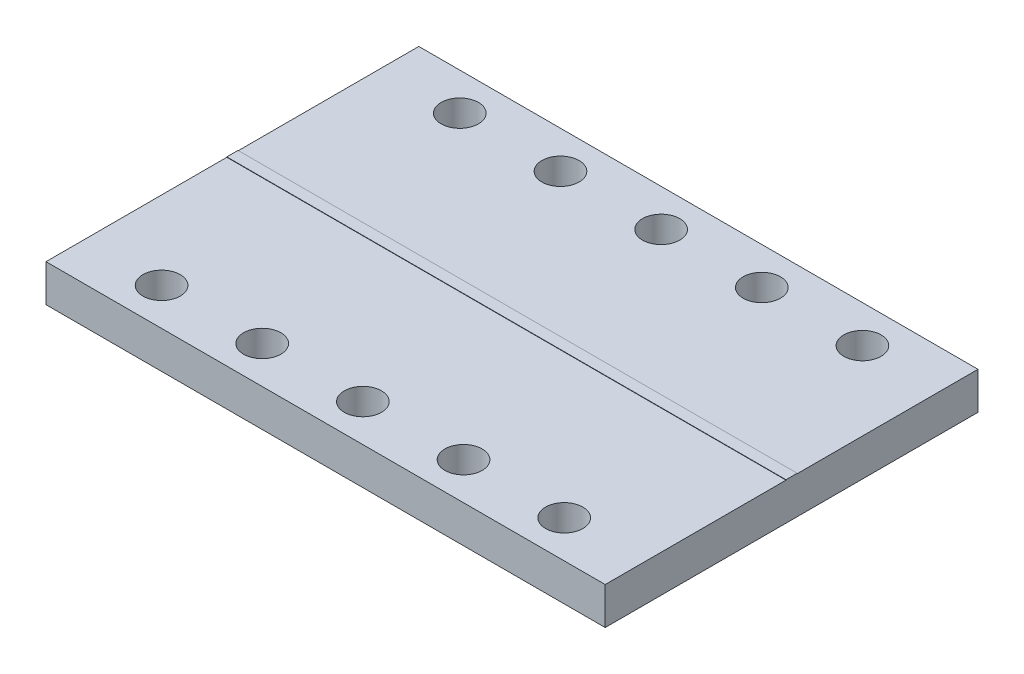
ISO-10303-21;
HEADER;
FILE_DESCRIPTION(('STEP AP214'),'2;1');
FILE_NAME('part.step','',(''),(''),'','','');
FILE_SCHEMA(('AUTOMOTIVE_DESIGN { 1 0 10303 214 1 1 1 1 }'));
ENDSEC;
DATA;
#1=APPLICATION_CONTEXT('core data for automotive mechanical design processes');
#2=APPLICATION_PROTOCOL_DEFINITION('international standard','automotive_design',2000,#1);
#3=PRODUCT_CONTEXT('',#1,'mechanical');
#4=PRODUCT('Part','Part','',(#3));
#5=PRODUCT_RELATED_PRODUCT_CATEGORY('part','',(#4));
#6=PRODUCT_DEFINITION_FORMATION('','',#4);
#7=PRODUCT_DEFINITION_CONTEXT('part definition',#1,'design');
#8=PRODUCT_DEFINITION('design','',#6,#7);
#9=PRODUCT_DEFINITION_SHAPE('','',#8);
#10=(LENGTH_UNIT() NAMED_UNIT(*) SI_UNIT(.MILLI.,.METRE.));
#11=(NAMED_UNIT(*) PLANE_ANGLE_UNIT() SI_UNIT($,.RADIAN.));
#12=(NAMED_UNIT(*) SI_UNIT($,.STERADIAN.) SOLID_ANGLE_UNIT());
#13=UNCERTAINTY_MEASURE_WITH_UNIT(LENGTH_MEASURE(1.E-05),#10,'distance_accuracy_value','');
#14=(GEOMETRIC_REPRESENTATION_CONTEXT(3) GLOBAL_UNCERTAINTY_ASSIGNED_CONTEXT((#13)) GLOBAL_UNIT_ASSIGNED_CONTEXT((#10,
#11,#12)) REPRESENTATION_CONTEXT('',''));
#15=CARTESIAN_POINT('',(0.,0.,0.));
#16=DIRECTION('',(0.,0.,1.));
#17=DIRECTION('',(1.,0.,0.));
#18=AXIS2_PLACEMENT_3D('',#15,#16,#17);
#19=CARTESIAN_POINT('',(0.,100.,0.));
#20=DIRECTION('',(0.,-1.,0.));
#21=DIRECTION('',(0.,0.,-1.));
#22=AXIS2_PLACEMENT_3D('',#19,#20,#21);
#23=PLANE('',#22);
#24=CARTESIAN_POINT('',(540.,100.,400.));
#25=DIRECTION('',(0.,1.,0.));
#26=DIRECTION('',(0.,0.,1.));
#27=AXIS2_PLACEMENT_3D('',#24,#25,#26);
#28=CIRCLE('',#27,50.);
#29=CARTESIAN_POINT('',(540.,100.,450.));
#30=VERTEX_POINT('',#29);
#31=EDGE_CURVE('E180',#30,#30,#28,.T.);
#32=ORIENTED_EDGE('',*,*,#31,.F.);
#33=EDGE_LOOP('',(#32));
#34=FACE_BOUND('',#33,.T.);
#35=CARTESIAN_POINT('',(270.,100.,400.));
#36=DIRECTION('',(0.,1.,0.));
#37=DIRECTION('',(0.,0.,1.));
#38=AXIS2_PLACEMENT_3D('',#35,#36,#37);
#39=CIRCLE('',#38,50.);
#40=CARTESIAN_POINT('',(270.,100.,450.));
#41=VERTEX_POINT('',#40);
#42=EDGE_CURVE('E188',#41,#41,#39,.T.);
#43=ORIENTED_EDGE('',*,*,#42,.F.);
#44=EDGE_LOOP('',(#43));
#45=FACE_BOUND('',#44,.T.);
#46=CARTESIAN_POINT('',(0.,100.,400.));
#47=DIRECTION('',(0.,1.,0.));
#48=DIRECTION('',(0.,0.,1.));
#49=AXIS2_PLACEMENT_3D('',#46,#47,#48);
#50=CIRCLE('',#49,50.);
#51=CARTESIAN_POINT('',(0.,100.,450.));
#52=VERTEX_POINT('',#51);
#53=EDGE_CURVE('E196',#52,#52,#50,.T.);
#54=ORIENTED_EDGE('',*,*,#53,.F.);
#55=EDGE_LOOP('',(#54));
#56=FACE_BOUND('',#55,.T.);
#57=CARTESIAN_POINT('',(-270.,100.,400.));
#58=DIRECTION('',(0.,1.,0.));
#59=DIRECTION('',(0.,0.,1.));
#60=AXIS2_PLACEMENT_3D('',#57,#58,#59);
#61=CIRCLE('',#60,50.);
#62=CARTESIAN_POINT('',(-270.,100.,450.));
#63=VERTEX_POINT('',#62);
#64=EDGE_CURVE('E204',#63,#63,#61,.T.);
#65=ORIENTED_EDGE('',*,*,#64,.F.);
#66=EDGE_LOOP('',(#65));
#67=FACE_BOUND('',#66,.T.);
#68=CARTESIAN_POINT('',(-540.,100.,400.));
#69=DIRECTION('',(0.,1.,0.));
#70=DIRECTION('',(0.,0.,1.));
#71=AXIS2_PLACEMENT_3D('',#68,#69,#70);
#72=CIRCLE('',#71,50.);
#73=CARTESIAN_POINT('',(-540.,100.,450.));
#74=VERTEX_POINT('',#73);
#75=EDGE_CURVE('E212',#74,#74,#72,.T.);
#76=ORIENTED_EDGE('',*,*,#75,.F.);
#77=EDGE_LOOP('',(#76));
#78=FACE_BOUND('',#77,.T.);
#79=DIRECTION('',(1.,0.,0.));
#80=VECTOR('',#79,1.);
#81=CARTESIAN_POINT('',(750.,100.,14.9999999999998));
#82=LINE('',#81,#80);
#83=CARTESIAN_POINT('',(-750.,100.,14.9999999999999));
#84=VERTEX_POINT('',#83);
#85=CARTESIAN_POINT('',(750.,100.,14.9999999999999));
#86=VERTEX_POINT('',#85);
#87=EDGE_CURVE('E57',#84,#86,#82,.T.);
#88=ORIENTED_EDGE('',*,*,#87,.F.);
#89=DIRECTION('',(0.,0.,1.));
#90=VECTOR('',#89,1.);
#91=CARTESIAN_POINT('',(-750.,100.,500.));
#92=LINE('',#91,#90);
#93=CARTESIAN_POINT('',(-750.,100.,500.));
#94=VERTEX_POINT('',#93);
#95=EDGE_CURVE('E131',#84,#94,#92,.T.);
#96=ORIENTED_EDGE('',*,*,#95,.T.);
#97=DIRECTION('',(1.,0.,0.));
#98=VECTOR('',#97,1.);
#99=CARTESIAN_POINT('',(-750.,100.,500.));
#100=LINE('',#99,#98);
#101=CARTESIAN_POINT('',(750.,100.,500.));
#102=VERTEX_POINT('',#101);
#103=EDGE_CURVE('E230',#94,#102,#100,.T.);
#104=ORIENTED_EDGE('',*,*,#103,.T.);
#105=DIRECTION('',(0.,0.,-1.));
#106=VECTOR('',#105,1.);
#107=CARTESIAN_POINT('',(750.,100.,500.));
#108=LINE('',#107,#106);
#109=EDGE_CURVE('E220',#102,#86,#108,.T.);
#110=ORIENTED_EDGE('',*,*,#109,.T.);
#111=EDGE_LOOP('',(#88,#96,#104,#110));
#112=FACE_BOUND('',#111,.T.);
#113=ADVANCED_FACE('F41',(#34,#45,#56,#67,#78,#112),#23,.F.);
#114=CARTESIAN_POINT('',(-540.000000000003,100.,-400.));
#115=DIRECTION('',(0.,1.,0.));
#116=DIRECTION('',(0.,0.,1.));
#117=AXIS2_PLACEMENT_3D('',#114,#115,#116);
#118=CIRCLE('',#117,50.);
#119=CARTESIAN_POINT('',(-540.000000000003,100.,-350.));
#120=VERTEX_POINT('',#119);
#121=EDGE_CURVE('E138',#120,#120,#118,.T.);
#122=ORIENTED_EDGE('',*,*,#121,.F.);
#123=EDGE_LOOP('',(#122));
#124=FACE_BOUND('',#123,.T.);
#125=CARTESIAN_POINT('',(539.999999999997,100.,-400.));
#126=DIRECTION('',(0.,1.,0.));
#127=DIRECTION('',(0.,0.,1.));
#128=AXIS2_PLACEMENT_3D('',#125,#126,#127);
#129=CIRCLE('',#128,50.);
#130=CARTESIAN_POINT('',(539.999999999997,100.,-350.));
#131=VERTEX_POINT('',#130);
#132=EDGE_CURVE('E148',#131,#131,#129,.T.);
#133=ORIENTED_EDGE('',*,*,#132,.F.);
#134=EDGE_LOOP('',(#133));
#135=FACE_BOUND('',#134,.T.);
#136=CARTESIAN_POINT('',(269.999999999997,100.,-400.));
#137=DIRECTION('',(0.,1.,0.));
#138=DIRECTION('',(0.,0.,1.));
#139=AXIS2_PLACEMENT_3D('',#136,#137,#138);
#140=CIRCLE('',#139,50.);
#141=CARTESIAN_POINT('',(269.999999999997,100.,-350.));
#142=VERTEX_POINT('',#141);
#143=EDGE_CURVE('E156',#142,#142,#140,.T.);
#144=ORIENTED_EDGE('',*,*,#143,.F.);
#145=EDGE_LOOP('',(#144));
#146=FACE_BOUND('',#145,.T.);
#147=CARTESIAN_POINT('',(-2.77555756156289E-12,100.,-400.));
#148=DIRECTION('',(0.,1.,0.));
#149=DIRECTION('',(0.,0.,1.));
#150=AXIS2_PLACEMENT_3D('',#147,#148,#149);
#151=CIRCLE('',#150,50.);
#152=CARTESIAN_POINT('',(-2.77555756156289E-12,100.,-350.));
#153=VERTEX_POINT('',#152);
#154=EDGE_CURVE('E164',#153,#153,#151,.T.);
#155=ORIENTED_EDGE('',*,*,#154,.F.);
#156=EDGE_LOOP('',(#155));
#157=FACE_BOUND('',#156,.T.);
#158=CARTESIAN_POINT('',(-270.000000000003,100.,-400.));
#159=DIRECTION('',(0.,1.,0.));
#160=DIRECTION('',(0.,0.,1.));
#161=AXIS2_PLACEMENT_3D('',#158,#159,#160);
#162=CIRCLE('',#161,50.);
#163=CARTESIAN_POINT('',(-270.000000000003,100.,-350.));
#164=VERTEX_POINT('',#163);
#165=EDGE_CURVE('E172',#164,#164,#162,.T.);
#166=ORIENTED_EDGE('',*,*,#165,.F.);
#167=EDGE_LOOP('',(#166));
#168=FACE_BOUND('',#167,.T.);
#169=DIRECTION('',(-1.,0.,0.));
#170=VECTOR('',#169,1.);
#171=CARTESIAN_POINT('',(-750.,100.,-15.));
#172=LINE('',#171,#170);
#173=CARTESIAN_POINT('',(750.,100.,-15.));
#174=VERTEX_POINT('',#173);
#175=CARTESIAN_POINT('',(-750.,100.,-15.));
#176=VERTEX_POINT('',#175);
#177=EDGE_CURVE('E65',#174,#176,#172,.T.);
#178=ORIENTED_EDGE('',*,*,#177,.F.);
#179=CARTESIAN_POINT('',(750.,100.,-500.));
#180=VERTEX_POINT('',#179);
#181=EDGE_CURVE('E224',#174,#180,#108,.T.);
#182=ORIENTED_EDGE('',*,*,#181,.T.);
#183=DIRECTION('',(-1.,0.,0.));
#184=VECTOR('',#183,1.);
#185=CARTESIAN_POINT('',(-750.,100.,-500.));
#186=LINE('',#185,#184);
#187=CARTESIAN_POINT('',(-750.,100.,-500.));
#188=VERTEX_POINT('',#187);
#189=EDGE_CURVE('E223',#180,#188,#186,.T.);
#190=ORIENTED_EDGE('',*,*,#189,.T.);
#191=EDGE_CURVE('E227',#188,#176,#92,.T.);
#192=ORIENTED_EDGE('',*,*,#191,.T.);
#193=EDGE_LOOP('',(#178,#182,#190,#192));
#194=FACE_BOUND('',#193,.T.);
#195=ADVANCED_FACE('F287',(#124,#135,#146,#157,#168,#194),#23,.F.);
#196=CARTESIAN_POINT('',(0.,0.,0.));
#197=DIRECTION('',(0.,-1.,0.));
#198=DIRECTION('',(0.,0.,-1.));
#199=AXIS2_PLACEMENT_3D('',#196,#197,#198);
#200=PLANE('',#199);
#201=CARTESIAN_POINT('',(539.999999999997,0.,-400.));
#202=DIRECTION('',(0.,1.,0.));
#203=DIRECTION('',(0.,0.,1.));
#204=AXIS2_PLACEMENT_3D('',#201,#202,#203);
#205=CIRCLE('',#204,50.);
#206=CARTESIAN_POINT('',(539.999999999997,0.,-350.));
#207=VERTEX_POINT('',#206);
#208=EDGE_CURVE('E146',#207,#207,#205,.T.);
#209=ORIENTED_EDGE('',*,*,#208,.T.);
#210=EDGE_LOOP('',(#209));
#211=FACE_BOUND('',#210,.T.);
#212=CARTESIAN_POINT('',(-2.77555756156289E-12,0.,-400.));
#213=DIRECTION('',(0.,1.,0.));
#214=DIRECTION('',(0.,0.,1.));
#215=AXIS2_PLACEMENT_3D('',#212,#213,#214);
#216=CIRCLE('',#215,50.);
#217=CARTESIAN_POINT('',(-2.77555756156289E-12,0.,-350.));
#218=VERTEX_POINT('',#217);
#219=EDGE_CURVE('E160',#218,#218,#216,.T.);
#220=ORIENTED_EDGE('',*,*,#219,.T.);
#221=EDGE_LOOP('',(#220));
#222=FACE_BOUND('',#221,.T.);
#223=CARTESIAN_POINT('',(540.,0.,400.));
#224=DIRECTION('',(0.,1.,0.));
#225=DIRECTION('',(0.,0.,1.));
#226=AXIS2_PLACEMENT_3D('',#223,#224,#225);
#227=CIRCLE('',#226,50.);
#228=CARTESIAN_POINT('',(540.,0.,450.));
#229=VERTEX_POINT('',#228);
#230=EDGE_CURVE('E176',#229,#229,#227,.T.);
#231=ORIENTED_EDGE('',*,*,#230,.T.);
#232=EDGE_LOOP('',(#231));
#233=FACE_BOUND('',#232,.T.);
#234=CARTESIAN_POINT('',(0.,0.,400.));
#235=DIRECTION('',(0.,1.,0.));
#236=DIRECTION('',(0.,0.,1.));
#237=AXIS2_PLACEMENT_3D('',#234,#235,#236);
#238=CIRCLE('',#237,50.);
#239=CARTESIAN_POINT('',(0.,0.,450.));
#240=VERTEX_POINT('',#239);
#241=EDGE_CURVE('E192',#240,#240,#238,.T.);
#242=ORIENTED_EDGE('',*,*,#241,.T.);
#243=EDGE_LOOP('',(#242));
#244=FACE_BOUND('',#243,.T.);
#245=CARTESIAN_POINT('',(-540.,0.,400.));
#246=DIRECTION('',(0.,1.,0.));
#247=DIRECTION('',(0.,0.,1.));
#248=AXIS2_PLACEMENT_3D('',#245,#246,#247);
#249=CIRCLE('',#248,50.);
#250=CARTESIAN_POINT('',(-540.,0.,450.));
#251=VERTEX_POINT('',#250);
#252=EDGE_CURVE('E208',#251,#251,#249,.T.);
#253=ORIENTED_EDGE('',*,*,#252,.T.);
#254=EDGE_LOOP('',(#253));
#255=FACE_BOUND('',#254,.T.);
#256=DIRECTION('',(0.,0.,-1.));
#257=VECTOR('',#256,1.);
#258=CARTESIAN_POINT('',(750.,0.,500.));
#259=LINE('',#258,#257);
#260=CARTESIAN_POINT('',(750.,0.,500.));
#261=VERTEX_POINT('',#260);
#262=CARTESIAN_POINT('',(750.,0.,-500.));
#263=VERTEX_POINT('',#262);
#264=EDGE_CURVE('E216',#261,#263,#259,.T.);
#265=ORIENTED_EDGE('',*,*,#264,.F.);
#266=DIRECTION('',(1.,0.,0.));
#267=VECTOR('',#266,1.);
#268=CARTESIAN_POINT('',(-750.,0.,500.));
#269=LINE('',#268,#267);
#270=CARTESIAN_POINT('',(-750.,0.,500.));
#271=VERTEX_POINT('',#270);
#272=EDGE_CURVE('E243',#271,#261,#269,.T.);
#273=ORIENTED_EDGE('',*,*,#272,.F.);
#274=DIRECTION('',(0.,0.,1.));
#275=VECTOR('',#274,1.);
#276=CARTESIAN_POINT('',(-750.,0.,500.));
#277=LINE('',#276,#275);
#278=CARTESIAN_POINT('',(-750.,0.,-500.));
#279=VERTEX_POINT('',#278);
#280=EDGE_CURVE('E240',#279,#271,#277,.T.);
#281=ORIENTED_EDGE('',*,*,#280,.F.);
#282=DIRECTION('',(-1.,0.,0.));
#283=VECTOR('',#282,1.);
#284=CARTESIAN_POINT('',(-750.,0.,-500.));
#285=LINE('',#284,#283);
#286=EDGE_CURVE('E237',#263,#279,#285,.T.);
#287=ORIENTED_EDGE('',*,*,#286,.F.);
#288=EDGE_LOOP('',(#265,#273,#281,#287));
#289=FACE_BOUND('',#288,.T.);
#290=CARTESIAN_POINT('',(-270.,0.,400.));
#291=DIRECTION('',(0.,1.,0.));
#292=DIRECTION('',(0.,0.,1.));
#293=AXIS2_PLACEMENT_3D('',#290,#291,#292);
#294=CIRCLE('',#293,50.);
#295=CARTESIAN_POINT('',(-270.,0.,450.));
#296=VERTEX_POINT('',#295);
#297=EDGE_CURVE('E200',#296,#296,#294,.T.);
#298=ORIENTED_EDGE('',*,*,#297,.T.);
#299=EDGE_LOOP('',(#298));
#300=FACE_BOUND('',#299,.T.);
#301=CARTESIAN_POINT('',(270.,0.,400.));
#302=DIRECTION('',(0.,1.,0.));
#303=DIRECTION('',(0.,0.,1.));
#304=AXIS2_PLACEMENT_3D('',#301,#302,#303);
#305=CIRCLE('',#304,50.);
#306=CARTESIAN_POINT('',(270.,0.,450.));
#307=VERTEX_POINT('',#306);
#308=EDGE_CURVE('E184',#307,#307,#305,.T.);
#309=ORIENTED_EDGE('',*,*,#308,.T.);
#310=EDGE_LOOP('',(#309));
#311=FACE_BOUND('',#310,.T.);
#312=CARTESIAN_POINT('',(-270.000000000003,0.,-400.));
#313=DIRECTION('',(0.,1.,0.));
#314=DIRECTION('',(0.,0.,1.));
#315=AXIS2_PLACEMENT_3D('',#312,#313,#314);
#316=CIRCLE('',#315,50.);
#317=CARTESIAN_POINT('',(-270.000000000003,0.,-350.));
#318=VERTEX_POINT('',#317);
#319=EDGE_CURVE('E168',#318,#318,#316,.T.);
#320=ORIENTED_EDGE('',*,*,#319,.T.);
#321=EDGE_LOOP('',(#320));
#322=FACE_BOUND('',#321,.T.);
#323=CARTESIAN_POINT('',(269.999999999997,0.,-400.));
#324=DIRECTION('',(0.,1.,0.));
#325=DIRECTION('',(0.,0.,1.));
#326=AXIS2_PLACEMENT_3D('',#323,#324,#325);
#327=CIRCLE('',#326,50.);
#328=CARTESIAN_POINT('',(269.999999999997,0.,-350.));
#329=VERTEX_POINT('',#328);
#330=EDGE_CURVE('E152',#329,#329,#327,.T.);
#331=ORIENTED_EDGE('',*,*,#330,.T.);
#332=EDGE_LOOP('',(#331));
#333=FACE_BOUND('',#332,.T.);
#334=CARTESIAN_POINT('',(-540.000000000003,0.,-400.));
#335=DIRECTION('',(0.,1.,0.));
#336=DIRECTION('',(0.,0.,1.));
#337=AXIS2_PLACEMENT_3D('',#334,#335,#336);
#338=CIRCLE('',#337,50.);
#339=CARTESIAN_POINT('',(-540.000000000003,0.,-350.));
#340=VERTEX_POINT('',#339);
#341=EDGE_CURVE('E133',#340,#340,#338,.T.);
#342=ORIENTED_EDGE('',*,*,#341,.T.);
#343=EDGE_LOOP('',(#342));
#344=FACE_BOUND('',#343,.T.);
#345=ADVANCED_FACE('F262',(#211,#222,#233,#244,#255,#289,#300,#311,#322,#333,#344),#200,.T.);
#346=CARTESIAN_POINT('',(750.,100.,500.));
#347=DIRECTION('',(-1.,0.,0.));
#348=DIRECTION('',(0.,0.,1.));
#349=AXIS2_PLACEMENT_3D('',#346,#347,#348);
#350=PLANE('',#349);
#351=ORIENTED_EDGE('',*,*,#264,.T.);
#352=DIRECTION('',(0.,-1.,0.));
#353=VECTOR('',#352,1.);
#354=CARTESIAN_POINT('',(750.,100.,-500.));
#355=LINE('',#354,#353);
#356=EDGE_CURVE('E11',#180,#263,#355,.T.);
#357=ORIENTED_EDGE('',*,*,#356,.F.);
#358=ORIENTED_EDGE('',*,*,#181,.F.);
#359=DIRECTION('',(0.,-1.,0.));
#360=VECTOR('',#359,1.);
#361=CARTESIAN_POINT('',(750.,101.,-15.));
#362=LINE('',#361,#360);
#363=CARTESIAN_POINT('',(750.,101.,-15.));
#364=VERTEX_POINT('',#363);
#365=EDGE_CURVE('E140',#364,#174,#362,.T.);
#366=ORIENTED_EDGE('',*,*,#365,.F.);
#367=DIRECTION('',(0.,0.,-1.));
#368=VECTOR('',#367,1.);
#369=CARTESIAN_POINT('',(750.,101.,-15.));
#370=LINE('',#369,#368);
#371=CARTESIAN_POINT('',(750.,101.,14.9999999999998));
#372=VERTEX_POINT('',#371);
#373=EDGE_CURVE('E117',#372,#364,#370,.T.);
#374=ORIENTED_EDGE('',*,*,#373,.F.);
#375=DIRECTION('',(0.,-1.,0.));
#376=VECTOR('',#375,1.);
#377=CARTESIAN_POINT('',(750.,101.,14.9999999999998));
#378=LINE('',#377,#376);
#379=EDGE_CURVE('E113',#372,#86,#378,.T.);
#380=ORIENTED_EDGE('',*,*,#379,.T.);
#381=ORIENTED_EDGE('',*,*,#109,.F.);
#382=DIRECTION('',(0.,-1.,0.));
#383=VECTOR('',#382,1.);
#384=CARTESIAN_POINT('',(750.,100.,500.));
#385=LINE('',#384,#383);
#386=EDGE_CURVE('E233',#102,#261,#385,.T.);
#387=ORIENTED_EDGE('',*,*,#386,.T.);
#388=EDGE_LOOP('',(#351,#357,#358,#366,#374,#380,#381,#387));
#389=FACE_BOUND('',#388,.T.);
#390=ADVANCED_FACE('F43',(#389),#350,.F.);
#391=CARTESIAN_POINT('',(-750.,100.,-500.));
#392=DIRECTION('',(0.,0.,1.));
#393=DIRECTION('',(1.,0.,0.));
#394=AXIS2_PLACEMENT_3D('',#391,#392,#393);
#395=PLANE('',#394);
#396=ORIENTED_EDGE('',*,*,#286,.T.);
#397=DIRECTION('',(0.,-1.,0.));
#398=VECTOR('',#397,1.);
#399=CARTESIAN_POINT('',(-750.,100.,-500.));
#400=LINE('',#399,#398);
#401=EDGE_CURVE('E50',#188,#279,#400,.T.);
#402=ORIENTED_EDGE('',*,*,#401,.F.);
#403=ORIENTED_EDGE('',*,*,#189,.F.);
#404=ORIENTED_EDGE('',*,*,#356,.T.);
#405=EDGE_LOOP('',(#396,#402,#403,#404));
#406=FACE_BOUND('',#405,.T.);
#407=ADVANCED_FACE('F288',(#406),#395,.F.);
#408=CARTESIAN_POINT('',(-750.,100.,500.));
#409=DIRECTION('',(1.,0.,0.));
#410=DIRECTION('',(0.,0.,-1.));
#411=AXIS2_PLACEMENT_3D('',#408,#409,#410);
#412=PLANE('',#411);
#413=ORIENTED_EDGE('',*,*,#280,.T.);
#414=DIRECTION('',(0.,-1.,0.));
#415=VECTOR('',#414,1.);
#416=CARTESIAN_POINT('',(-750.,100.,500.));
#417=LINE('',#416,#415);
#418=EDGE_CURVE('E249',#94,#271,#417,.T.);
#419=ORIENTED_EDGE('',*,*,#418,.F.);
#420=ORIENTED_EDGE('',*,*,#95,.F.);
#421=DIRECTION('',(0.,-1.,0.));
#422=VECTOR('',#421,1.);
#423=CARTESIAN_POINT('',(-750.,101.,15.));
#424=LINE('',#423,#422);
#425=CARTESIAN_POINT('',(-750.,101.,15.));
#426=VERTEX_POINT('',#425);
#427=EDGE_CURVE('E111',#426,#84,#424,.T.);
#428=ORIENTED_EDGE('',*,*,#427,.F.);
#429=DIRECTION('',(0.,0.,1.));
#430=VECTOR('',#429,1.);
#431=CARTESIAN_POINT('',(-750.,101.,15.));
#432=LINE('',#431,#430);
#433=CARTESIAN_POINT('',(-750.,101.,-15.));
#434=VERTEX_POINT('',#433);
#435=EDGE_CURVE('E118',#434,#426,#432,.T.);
#436=ORIENTED_EDGE('',*,*,#435,.F.);
#437=DIRECTION('',(0.,-1.,0.));
#438=VECTOR('',#437,1.);
#439=CARTESIAN_POINT('',(-750.,101.,-15.));
#440=LINE('',#439,#438);
#441=EDGE_CURVE('E278',#434,#176,#440,.T.);
#442=ORIENTED_EDGE('',*,*,#441,.T.);
#443=ORIENTED_EDGE('',*,*,#191,.F.);
#444=ORIENTED_EDGE('',*,*,#401,.T.);
#445=EDGE_LOOP('',(#413,#419,#420,#428,#436,#442,#443,#444));
#446=FACE_BOUND('',#445,.T.);
#447=ADVANCED_FACE('F129',(#446),#412,.F.);
#448=CARTESIAN_POINT('',(-750.,100.,500.));
#449=DIRECTION('',(0.,0.,-1.));
#450=DIRECTION('',(-1.,0.,0.));
#451=AXIS2_PLACEMENT_3D('',#448,#449,#450);
#452=PLANE('',#451);
#453=ORIENTED_EDGE('',*,*,#272,.T.);
#454=ORIENTED_EDGE('',*,*,#386,.F.);
#455=ORIENTED_EDGE('',*,*,#103,.F.);
#456=ORIENTED_EDGE('',*,*,#418,.T.);
#457=EDGE_LOOP('',(#453,#454,#455,#456));
#458=FACE_BOUND('',#457,.T.);
#459=ADVANCED_FACE('F266',(#458),#452,.F.);
#460=CARTESIAN_POINT('',(-540.,100.,400.));
#461=DIRECTION('',(0.,-1.,0.));
#462=DIRECTION('',(0.,0.,-1.));
#463=AXIS2_PLACEMENT_3D('',#460,#461,#462);
#464=CYLINDRICAL_SURFACE('',#463,50.);
#465=ORIENTED_EDGE('',*,*,#75,.T.);
#466=EDGE_LOOP('',(#465));
#467=FACE_BOUND('',#466,.T.);
#468=ORIENTED_EDGE('',*,*,#252,.F.);
#469=EDGE_LOOP('',(#468));
#470=FACE_BOUND('',#469,.T.);
#471=ADVANCED_FACE('F306',(#467,#470),#464,.F.);
#472=CARTESIAN_POINT('',(-270.,100.,400.));
#473=DIRECTION('',(0.,-1.,0.));
#474=DIRECTION('',(0.,0.,-1.));
#475=AXIS2_PLACEMENT_3D('',#472,#473,#474);
#476=CYLINDRICAL_SURFACE('',#475,50.);
#477=ORIENTED_EDGE('',*,*,#64,.T.);
#478=EDGE_LOOP('',(#477));
#479=FACE_BOUND('',#478,.T.);
#480=ORIENTED_EDGE('',*,*,#297,.F.);
#481=EDGE_LOOP('',(#480));
#482=FACE_BOUND('',#481,.T.);
#483=ADVANCED_FACE('F315',(#479,#482),#476,.F.);
#484=CARTESIAN_POINT('',(0.,100.,400.));
#485=DIRECTION('',(0.,-1.,0.));
#486=DIRECTION('',(0.,0.,-1.));
#487=AXIS2_PLACEMENT_3D('',#484,#485,#486);
#488=CYLINDRICAL_SURFACE('',#487,50.);
#489=ORIENTED_EDGE('',*,*,#53,.T.);
#490=EDGE_LOOP('',(#489));
#491=FACE_BOUND('',#490,.T.);
#492=ORIENTED_EDGE('',*,*,#241,.F.);
#493=EDGE_LOOP('',(#492));
#494=FACE_BOUND('',#493,.T.);
#495=ADVANCED_FACE('F320',(#491,#494),#488,.F.);
#496=CARTESIAN_POINT('',(270.,100.,400.));
#497=DIRECTION('',(0.,-1.,0.));
#498=DIRECTION('',(0.,0.,-1.));
#499=AXIS2_PLACEMENT_3D('',#496,#497,#498);
#500=CYLINDRICAL_SURFACE('',#499,50.);
#501=ORIENTED_EDGE('',*,*,#42,.T.);
#502=EDGE_LOOP('',(#501));
#503=FACE_BOUND('',#502,.T.);
#504=ORIENTED_EDGE('',*,*,#308,.F.);
#505=EDGE_LOOP('',(#504));
#506=FACE_BOUND('',#505,.T.);
#507=ADVANCED_FACE('F330',(#503,#506),#500,.F.);
#508=CARTESIAN_POINT('',(540.,100.,400.));
#509=DIRECTION('',(0.,-1.,0.));
#510=DIRECTION('',(0.,0.,-1.));
#511=AXIS2_PLACEMENT_3D('',#508,#509,#510);
#512=CYLINDRICAL_SURFACE('',#511,50.);
#513=ORIENTED_EDGE('',*,*,#31,.T.);
#514=EDGE_LOOP('',(#513));
#515=FACE_BOUND('',#514,.T.);
#516=ORIENTED_EDGE('',*,*,#230,.F.);
#517=EDGE_LOOP('',(#516));
#518=FACE_BOUND('',#517,.T.);
#519=ADVANCED_FACE('F337',(#515,#518),#512,.F.);
#520=CARTESIAN_POINT('',(-270.000000000003,100.,-400.));
#521=DIRECTION('',(0.,-1.,0.));
#522=DIRECTION('',(0.,0.,-1.));
#523=AXIS2_PLACEMENT_3D('',#520,#521,#522);
#524=CYLINDRICAL_SURFACE('',#523,50.);
#525=ORIENTED_EDGE('',*,*,#165,.T.);
#526=EDGE_LOOP('',(#525));
#527=FACE_BOUND('',#526,.T.);
#528=ORIENTED_EDGE('',*,*,#319,.F.);
#529=EDGE_LOOP('',(#528));
#530=FACE_BOUND('',#529,.T.);
#531=ADVANCED_FACE('F341',(#527,#530),#524,.F.);
#532=CARTESIAN_POINT('',(-2.77555756156289E-12,100.,-400.));
#533=DIRECTION('',(0.,-1.,0.));
#534=DIRECTION('',(0.,0.,-1.));
#535=AXIS2_PLACEMENT_3D('',#532,#533,#534);
#536=CYLINDRICAL_SURFACE('',#535,50.);
#537=ORIENTED_EDGE('',*,*,#154,.T.);
#538=EDGE_LOOP('',(#537));
#539=FACE_BOUND('',#538,.T.);
#540=ORIENTED_EDGE('',*,*,#219,.F.);
#541=EDGE_LOOP('',(#540));
#542=FACE_BOUND('',#541,.T.);
#543=ADVANCED_FACE('F345',(#539,#542),#536,.F.);
#544=CARTESIAN_POINT('',(269.999999999997,100.,-400.));
#545=DIRECTION('',(0.,-1.,0.));
#546=DIRECTION('',(0.,0.,-1.));
#547=AXIS2_PLACEMENT_3D('',#544,#545,#546);
#548=CYLINDRICAL_SURFACE('',#547,50.);
#549=ORIENTED_EDGE('',*,*,#143,.T.);
#550=EDGE_LOOP('',(#549));
#551=FACE_BOUND('',#550,.T.);
#552=ORIENTED_EDGE('',*,*,#330,.F.);
#553=EDGE_LOOP('',(#552));
#554=FACE_BOUND('',#553,.T.);
#555=ADVANCED_FACE('F349',(#551,#554),#548,.F.);
#556=CARTESIAN_POINT('',(539.999999999997,100.,-400.));
#557=DIRECTION('',(0.,-1.,0.));
#558=DIRECTION('',(0.,0.,-1.));
#559=AXIS2_PLACEMENT_3D('',#556,#557,#558);
#560=CYLINDRICAL_SURFACE('',#559,50.);
#561=ORIENTED_EDGE('',*,*,#132,.T.);
#562=EDGE_LOOP('',(#561));
#563=FACE_BOUND('',#562,.T.);
#564=ORIENTED_EDGE('',*,*,#208,.F.);
#565=EDGE_LOOP('',(#564));
#566=FACE_BOUND('',#565,.T.);
#567=ADVANCED_FACE('F353',(#563,#566),#560,.F.);
#568=CARTESIAN_POINT('',(-540.000000000003,100.,-400.));
#569=DIRECTION('',(0.,-1.,0.));
#570=DIRECTION('',(0.,0.,-1.));
#571=AXIS2_PLACEMENT_3D('',#568,#569,#570);
#572=CYLINDRICAL_SURFACE('',#571,50.);
#573=ORIENTED_EDGE('',*,*,#121,.T.);
#574=EDGE_LOOP('',(#573));
#575=FACE_BOUND('',#574,.T.);
#576=ORIENTED_EDGE('',*,*,#341,.F.);
#577=EDGE_LOOP('',(#576));
#578=FACE_BOUND('',#577,.T.);
#579=ADVANCED_FACE('F357',(#575,#578),#572,.F.);
#580=CARTESIAN_POINT('',(750.,101.,14.9999999999998));
#581=DIRECTION('',(0.,0.,-1.));
#582=DIRECTION('',(-1.,0.,0.));
#583=AXIS2_PLACEMENT_3D('',#580,#581,#582);
#584=PLANE('',#583);
#585=ORIENTED_EDGE('',*,*,#87,.T.);
#586=ORIENTED_EDGE('',*,*,#379,.F.);
#587=DIRECTION('',(1.,0.,0.));
#588=VECTOR('',#587,1.);
#589=CARTESIAN_POINT('',(750.,101.,14.9999999999998));
#590=LINE('',#589,#588);
#591=EDGE_CURVE('E107',#426,#372,#590,.T.);
#592=ORIENTED_EDGE('',*,*,#591,.F.);
#593=ORIENTED_EDGE('',*,*,#427,.T.);
#594=EDGE_LOOP('',(#585,#586,#592,#593));
#595=FACE_BOUND('',#594,.T.);
#596=ADVANCED_FACE('F109',(#595),#584,.F.);
#597=CARTESIAN_POINT('',(-750.,101.,-15.));
#598=DIRECTION('',(0.,0.,1.));
#599=DIRECTION('',(1.,0.,0.));
#600=AXIS2_PLACEMENT_3D('',#597,#598,#599);
#601=PLANE('',#600);
#602=ORIENTED_EDGE('',*,*,#177,.T.);
#603=ORIENTED_EDGE('',*,*,#441,.F.);
#604=DIRECTION('',(-1.,0.,0.));
#605=VECTOR('',#604,1.);
#606=CARTESIAN_POINT('',(-750.,101.,-15.));
#607=LINE('',#606,#605);
#608=EDGE_CURVE('E123',#364,#434,#607,.T.);
#609=ORIENTED_EDGE('',*,*,#608,.F.);
#610=ORIENTED_EDGE('',*,*,#365,.T.);
#611=EDGE_LOOP('',(#602,#603,#609,#610));
#612=FACE_BOUND('',#611,.T.);
#613=ADVANCED_FACE('F284',(#612),#601,.F.);
#614=CARTESIAN_POINT('',(0.,101.,0.));
#615=DIRECTION('',(0.,-1.,0.));
#616=DIRECTION('',(0.,0.,-1.));
#617=AXIS2_PLACEMENT_3D('',#614,#615,#616);
#618=PLANE('',#617);
#619=ORIENTED_EDGE('',*,*,#435,.T.);
#620=ORIENTED_EDGE('',*,*,#591,.T.);
#621=ORIENTED_EDGE('',*,*,#373,.T.);
#622=ORIENTED_EDGE('',*,*,#608,.T.);
#623=EDGE_LOOP('',(#619,#620,#621,#622));
#624=FACE_BOUND('',#623,.T.);
#625=ADVANCED_FACE('F121',(#624),#618,.F.);
#626=CLOSED_SHELL('',(#113,#195,#345,#390,#407,#447,#459,#471,#483,#495,#507,#519,#531,#543,
#555,#567,#579,#596,#613,#625));
#627=MANIFOLD_SOLID_BREP('B2',#626);
#628=ADVANCED_BREP_SHAPE_REPRESENTATION('',(#18,#627),#14);
#629=SHAPE_DEFINITION_REPRESENTATION(#9,#628);
ENDSEC;
END-ISO-10303-21;
